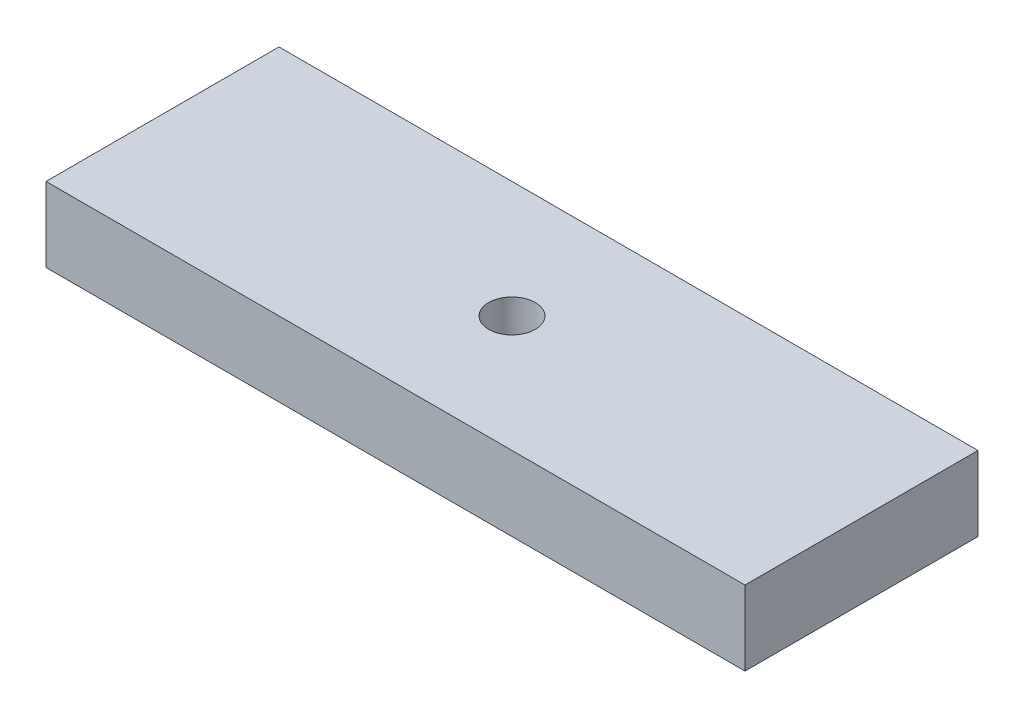
ISO-10303-21;
HEADER;
FILE_DESCRIPTION(('STEP AP214'),'2;1');
FILE_NAME('part.step','',(''),(''),'','','');
FILE_SCHEMA(('AUTOMOTIVE_DESIGN { 1 0 10303 214 1 1 1 1 }'));
ENDSEC;
DATA;
#1=APPLICATION_CONTEXT('core data for automotive mechanical design processes');
#2=APPLICATION_PROTOCOL_DEFINITION('international standard','automotive_design',2000,#1);
#3=PRODUCT_CONTEXT('',#1,'mechanical');
#4=PRODUCT('Part','Part','',(#3));
#5=PRODUCT_RELATED_PRODUCT_CATEGORY('part','',(#4));
#6=PRODUCT_DEFINITION_FORMATION('','',#4);
#7=PRODUCT_DEFINITION_CONTEXT('part definition',#1,'design');
#8=PRODUCT_DEFINITION('design','',#6,#7);
#9=PRODUCT_DEFINITION_SHAPE('','',#8);
#10=(LENGTH_UNIT() NAMED_UNIT(*) SI_UNIT(.MILLI.,.METRE.));
#11=(NAMED_UNIT(*) PLANE_ANGLE_UNIT() SI_UNIT($,.RADIAN.));
#12=(NAMED_UNIT(*) SI_UNIT($,.STERADIAN.) SOLID_ANGLE_UNIT());
#13=UNCERTAINTY_MEASURE_WITH_UNIT(LENGTH_MEASURE(1.E-05),#10,'distance_accuracy_value','');
#14=(GEOMETRIC_REPRESENTATION_CONTEXT(3) GLOBAL_UNCERTAINTY_ASSIGNED_CONTEXT((#13)) GLOBAL_UNIT_ASSIGNED_CONTEXT((#10,
#11,#12)) REPRESENTATION_CONTEXT('',''));
#15=CARTESIAN_POINT('',(0.,0.,0.));
#16=DIRECTION('',(0.,0.,1.));
#17=DIRECTION('',(1.,0.,0.));
#18=AXIS2_PLACEMENT_3D('',#15,#16,#17);
#19=CARTESIAN_POINT('',(-75.,16.,25.));
#20=DIRECTION('',(1.,0.,0.));
#21=DIRECTION('',(0.,0.,-1.));
#22=AXIS2_PLACEMENT_3D('',#19,#20,#21);
#23=PLANE('',#22);
#24=DIRECTION('',(0.,0.,1.));
#25=VECTOR('',#24,1.);
#26=CARTESIAN_POINT('',(-75.,0.,25.));
#27=LINE('',#26,#25);
#28=CARTESIAN_POINT('',(-75.,0.,-25.));
#29=VERTEX_POINT('',#28);
#30=CARTESIAN_POINT('',(-75.,0.,25.));
#31=VERTEX_POINT('',#30);
#32=EDGE_CURVE('E96',#29,#31,#27,.T.);
#33=ORIENTED_EDGE('',*,*,#32,.T.);
#34=DIRECTION('',(0.,-1.,0.));
#35=VECTOR('',#34,1.);
#36=CARTESIAN_POINT('',(-75.,16.,25.));
#37=LINE('',#36,#35);
#38=CARTESIAN_POINT('',(-75.,16.,25.));
#39=VERTEX_POINT('',#38);
#40=EDGE_CURVE('E11',#39,#31,#37,.T.);
#41=ORIENTED_EDGE('',*,*,#40,.F.);
#42=DIRECTION('',(0.,0.,1.));
#43=VECTOR('',#42,1.);
#44=CARTESIAN_POINT('',(-75.,16.,25.));
#45=LINE('',#44,#43);
#46=CARTESIAN_POINT('',(-75.,16.,-25.));
#47=VERTEX_POINT('',#46);
#48=EDGE_CURVE('E84',#47,#39,#45,.T.);
#49=ORIENTED_EDGE('',*,*,#48,.F.);
#50=DIRECTION('',(0.,-1.,0.));
#51=VECTOR('',#50,1.);
#52=CARTESIAN_POINT('',(-75.,16.,-25.));
#53=LINE('',#52,#51);
#54=EDGE_CURVE('E92',#47,#29,#53,.T.);
#55=ORIENTED_EDGE('',*,*,#54,.T.);
#56=EDGE_LOOP('',(#33,#41,#49,#55));
#57=FACE_BOUND('',#56,.T.);
#58=ADVANCED_FACE('F33',(#57),#23,.F.);
#59=CARTESIAN_POINT('',(75.,16.,25.));
#60=DIRECTION('',(0.,0.,-1.));
#61=DIRECTION('',(-1.,0.,0.));
#62=AXIS2_PLACEMENT_3D('',#59,#60,#61);
#63=PLANE('',#62);
#64=DIRECTION('',(1.,0.,0.));
#65=VECTOR('',#64,1.);
#66=CARTESIAN_POINT('',(75.,0.,25.));
#67=LINE('',#66,#65);
#68=CARTESIAN_POINT('',(75.,0.,25.));
#69=VERTEX_POINT('',#68);
#70=EDGE_CURVE('E88',#31,#69,#67,.T.);
#71=ORIENTED_EDGE('',*,*,#70,.T.);
#72=DIRECTION('',(0.,-1.,0.));
#73=VECTOR('',#72,1.);
#74=CARTESIAN_POINT('',(75.,16.,25.));
#75=LINE('',#74,#73);
#76=CARTESIAN_POINT('',(75.,16.,25.));
#77=VERTEX_POINT('',#76);
#78=EDGE_CURVE('E41',#77,#69,#75,.T.);
#79=ORIENTED_EDGE('',*,*,#78,.F.);
#80=DIRECTION('',(1.,0.,0.));
#81=VECTOR('',#80,1.);
#82=CARTESIAN_POINT('',(75.,16.,25.));
#83=LINE('',#82,#81);
#84=EDGE_CURVE('E79',#39,#77,#83,.T.);
#85=ORIENTED_EDGE('',*,*,#84,.F.);
#86=ORIENTED_EDGE('',*,*,#40,.T.);
#87=EDGE_LOOP('',(#71,#79,#85,#86));
#88=FACE_BOUND('',#87,.T.);
#89=ADVANCED_FACE('F87',(#88),#63,.F.);
#90=CARTESIAN_POINT('',(75.,16.,25.));
#91=DIRECTION('',(-1.,0.,0.));
#92=DIRECTION('',(0.,0.,1.));
#93=AXIS2_PLACEMENT_3D('',#90,#91,#92);
#94=PLANE('',#93);
#95=DIRECTION('',(0.,0.,-1.));
#96=VECTOR('',#95,1.);
#97=CARTESIAN_POINT('',(75.,0.,25.));
#98=LINE('',#97,#96);
#99=CARTESIAN_POINT('',(75.,0.,-25.));
#100=VERTEX_POINT('',#99);
#101=EDGE_CURVE('E66',#69,#100,#98,.T.);
#102=ORIENTED_EDGE('',*,*,#101,.T.);
#103=DIRECTION('',(0.,-1.,0.));
#104=VECTOR('',#103,1.);
#105=CARTESIAN_POINT('',(75.,16.,-25.));
#106=LINE('',#105,#104);
#107=CARTESIAN_POINT('',(75.,16.,-25.));
#108=VERTEX_POINT('',#107);
#109=EDGE_CURVE('E89',#108,#100,#106,.T.);
#110=ORIENTED_EDGE('',*,*,#109,.F.);
#111=DIRECTION('',(0.,0.,-1.));
#112=VECTOR('',#111,1.);
#113=CARTESIAN_POINT('',(75.,16.,25.));
#114=LINE('',#113,#112);
#115=EDGE_CURVE('E82',#77,#108,#114,.T.);
#116=ORIENTED_EDGE('',*,*,#115,.F.);
#117=ORIENTED_EDGE('',*,*,#78,.T.);
#118=EDGE_LOOP('',(#102,#110,#116,#117));
#119=FACE_BOUND('',#118,.T.);
#120=ADVANCED_FACE('F90',(#119),#94,.F.);
#121=CARTESIAN_POINT('',(75.,16.,-25.));
#122=DIRECTION('',(0.,0.,1.));
#123=DIRECTION('',(1.,0.,0.));
#124=AXIS2_PLACEMENT_3D('',#121,#122,#123);
#125=PLANE('',#124);
#126=DIRECTION('',(-1.,0.,0.));
#127=VECTOR('',#126,1.);
#128=CARTESIAN_POINT('',(75.,0.,-25.));
#129=LINE('',#128,#127);
#130=EDGE_CURVE('E72',#100,#29,#129,.T.);
#131=ORIENTED_EDGE('',*,*,#130,.T.);
#132=ORIENTED_EDGE('',*,*,#54,.F.);
#133=DIRECTION('',(-1.,0.,0.));
#134=VECTOR('',#133,1.);
#135=CARTESIAN_POINT('',(75.,16.,-25.));
#136=LINE('',#135,#134);
#137=EDGE_CURVE('E49',#108,#47,#136,.T.);
#138=ORIENTED_EDGE('',*,*,#137,.F.);
#139=ORIENTED_EDGE('',*,*,#109,.T.);
#140=EDGE_LOOP('',(#131,#132,#138,#139));
#141=FACE_BOUND('',#140,.T.);
#142=ADVANCED_FACE('F104',(#141),#125,.F.);
#143=CARTESIAN_POINT('',(0.,16.,0.));
#144=DIRECTION('',(0.,1.,0.));
#145=DIRECTION('',(0.,0.,1.));
#146=AXIS2_PLACEMENT_3D('',#143,#144,#145);
#147=PLANE('',#146);
#148=CARTESIAN_POINT('',(0.,16.,0.));
#149=DIRECTION('',(0.,1.,0.));
#150=DIRECTION('',(0.,0.,1.));
#151=AXIS2_PLACEMENT_3D('',#148,#149,#150);
#152=CIRCLE('',#151,5.);
#153=CARTESIAN_POINT('',(0.,16.,5.));
#154=VERTEX_POINT('',#153);
#155=EDGE_CURVE('E110',#154,#154,#152,.T.);
#156=ORIENTED_EDGE('',*,*,#155,.F.);
#157=EDGE_LOOP('',(#156));
#158=FACE_BOUND('',#157,.T.);
#159=ORIENTED_EDGE('',*,*,#48,.T.);
#160=ORIENTED_EDGE('',*,*,#84,.T.);
#161=ORIENTED_EDGE('',*,*,#115,.T.);
#162=ORIENTED_EDGE('',*,*,#137,.T.);
#163=EDGE_LOOP('',(#159,#160,#161,#162));
#164=FACE_BOUND('',#163,.T.);
#165=ADVANCED_FACE('F80',(#158,#164),#147,.T.);
#166=CARTESIAN_POINT('',(0.,0.,0.));
#167=DIRECTION('',(0.,1.,0.));
#168=DIRECTION('',(0.,0.,1.));
#169=AXIS2_PLACEMENT_3D('',#166,#167,#168);
#170=PLANE('',#169);
#171=CARTESIAN_POINT('',(0.,0.,0.));
#172=DIRECTION('',(0.,1.,0.));
#173=DIRECTION('',(0.,0.,1.));
#174=AXIS2_PLACEMENT_3D('',#171,#172,#173);
#175=CIRCLE('',#174,5.);
#176=CARTESIAN_POINT('',(0.,0.,5.));
#177=VERTEX_POINT('',#176);
#178=EDGE_CURVE('E99',#177,#177,#175,.T.);
#179=ORIENTED_EDGE('',*,*,#178,.T.);
#180=EDGE_LOOP('',(#179));
#181=FACE_BOUND('',#180,.T.);
#182=ORIENTED_EDGE('',*,*,#32,.F.);
#183=ORIENTED_EDGE('',*,*,#130,.F.);
#184=ORIENTED_EDGE('',*,*,#101,.F.);
#185=ORIENTED_EDGE('',*,*,#70,.F.);
#186=EDGE_LOOP('',(#182,#183,#184,#185));
#187=FACE_BOUND('',#186,.T.);
#188=ADVANCED_FACE('F107',(#181,#187),#170,.F.);
#189=CARTESIAN_POINT('',(0.,0.,0.));
#190=DIRECTION('',(0.,1.,0.));
#191=DIRECTION('',(0.,0.,1.));
#192=AXIS2_PLACEMENT_3D('',#189,#190,#191);
#193=CYLINDRICAL_SURFACE('',#192,5.);
#194=ORIENTED_EDGE('',*,*,#178,.F.);
#195=EDGE_LOOP('',(#194));
#196=FACE_BOUND('',#195,.T.);
#197=ORIENTED_EDGE('',*,*,#155,.T.);
#198=EDGE_LOOP('',(#197));
#199=FACE_BOUND('',#198,.T.);
#200=ADVANCED_FACE('F117',(#196,#199),#193,.F.);
#201=CLOSED_SHELL('',(#58,#89,#120,#142,#165,#188,#200));
#202=MANIFOLD_SOLID_BREP('B2',#201);
#203=ADVANCED_BREP_SHAPE_REPRESENTATION('',(#18,#202),#14);
#204=SHAPE_DEFINITION_REPRESENTATION(#9,#203);
ENDSEC;
END-ISO-10303-21;
